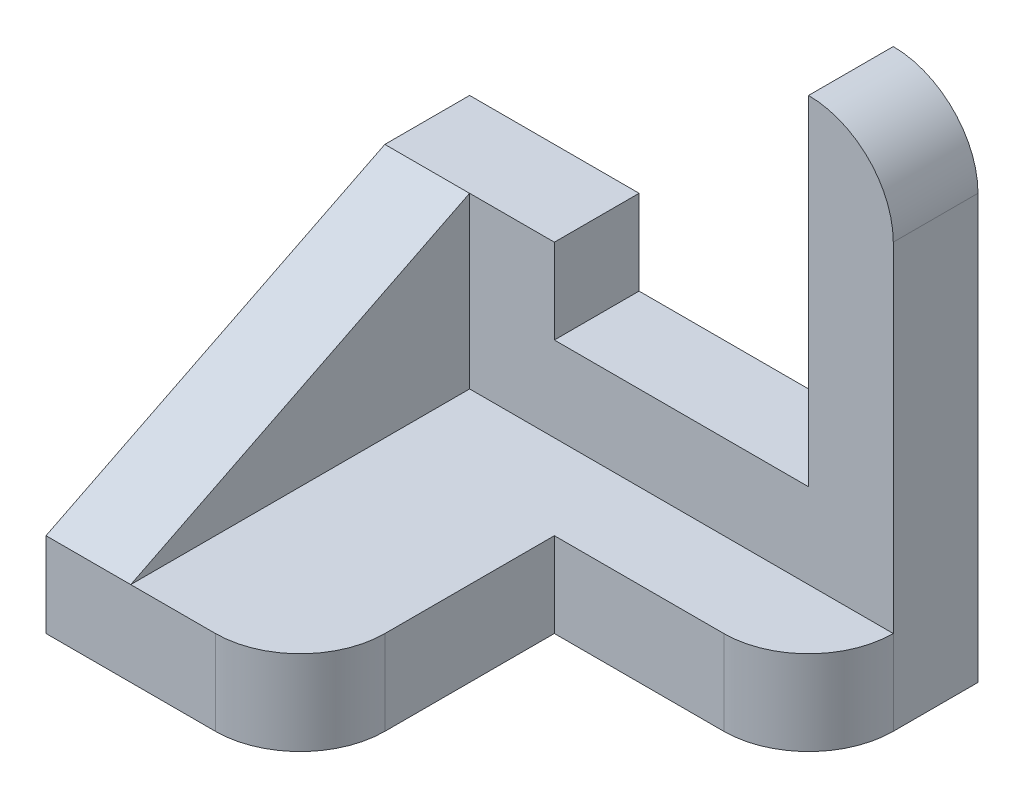
ISO-10303-21;
HEADER;
FILE_DESCRIPTION(('STEP AP214'),'2;1');
FILE_NAME('part.step','',(''),(''),'','','');
FILE_SCHEMA(('AUTOMOTIVE_DESIGN { 1 0 10303 214 1 1 1 1 }'));
ENDSEC;
DATA;
#1=APPLICATION_CONTEXT('core data for automotive mechanical design processes');
#2=APPLICATION_PROTOCOL_DEFINITION('international standard','automotive_design',2000,#1);
#3=PRODUCT_CONTEXT('',#1,'mechanical');
#4=PRODUCT('Part','Part','',(#3));
#5=PRODUCT_RELATED_PRODUCT_CATEGORY('part','',(#4));
#6=PRODUCT_DEFINITION_FORMATION('','',#4);
#7=PRODUCT_DEFINITION_CONTEXT('part definition',#1,'design');
#8=PRODUCT_DEFINITION('design','',#6,#7);
#9=PRODUCT_DEFINITION_SHAPE('','',#8);
#10=(LENGTH_UNIT() NAMED_UNIT(*) SI_UNIT(.MILLI.,.METRE.));
#11=(NAMED_UNIT(*) PLANE_ANGLE_UNIT() SI_UNIT($,.RADIAN.));
#12=(NAMED_UNIT(*) SI_UNIT($,.STERADIAN.) SOLID_ANGLE_UNIT());
#13=UNCERTAINTY_MEASURE_WITH_UNIT(LENGTH_MEASURE(1.E-05),#10,'distance_accuracy_value','');
#14=(GEOMETRIC_REPRESENTATION_CONTEXT(3) GLOBAL_UNCERTAINTY_ASSIGNED_CONTEXT((#13)) GLOBAL_UNIT_ASSIGNED_CONTEXT((#10,
#11,#12)) REPRESENTATION_CONTEXT('',''));
#15=CARTESIAN_POINT('',(0.,0.,0.));
#16=DIRECTION('',(0.,0.,1.));
#17=DIRECTION('',(1.,0.,0.));
#18=AXIS2_PLACEMENT_3D('',#15,#16,#17);
#19=CARTESIAN_POINT('',(-52.8523690129948,20.,0.));
#20=DIRECTION('',(-1.,0.,0.));
#21=DIRECTION('',(0.,0.,1.));
#22=AXIS2_PLACEMENT_3D('',#19,#20,#21);
#23=PLANE('',#22);
#24=DIRECTION('',(0.,-1.,0.));
#25=VECTOR('',#24,1.);
#26=CARTESIAN_POINT('',(-52.8523690129948,20.,-20.));
#27=LINE('',#26,#25);
#28=CARTESIAN_POINT('',(-52.8523690129948,20.,-20.));
#29=VERTEX_POINT('',#28);
#30=CARTESIAN_POINT('',(-52.8523690129948,-10.,-20.));
#31=VERTEX_POINT('',#30);
#32=EDGE_CURVE('E218',#29,#31,#27,.T.);
#33=ORIENTED_EDGE('',*,*,#32,.T.);
#34=DIRECTION('',(0.,0.,-1.));
#35=VECTOR('',#34,1.);
#36=CARTESIAN_POINT('',(-52.8523690129948,-10.,0.));
#37=LINE('',#36,#35);
#38=CARTESIAN_POINT('',(-52.8523690129948,-10.,30.));
#39=VERTEX_POINT('',#38);
#40=EDGE_CURVE('E158',#39,#31,#37,.T.);
#41=ORIENTED_EDGE('',*,*,#40,.F.);
#42=DIRECTION('',(0.,1.,0.));
#43=VECTOR('',#42,1.);
#44=CARTESIAN_POINT('',(-52.8523690129948,-10.,30.));
#45=LINE('',#44,#43);
#46=CARTESIAN_POINT('',(-52.8523690129948,0.,30.));
#47=VERTEX_POINT('',#46);
#48=EDGE_CURVE('E180',#39,#47,#45,.T.);
#49=ORIENTED_EDGE('',*,*,#48,.T.);
#50=DIRECTION('',(0.,0.447290848418711,-0.894388560370083));
#51=VECTOR('',#50,1.);
#52=CARTESIAN_POINT('',(-52.8523690129948,16.0029366011003,-1.99896326730458));
#53=LINE('',#52,#51);
#54=CARTESIAN_POINT('',(-52.8523690129948,20.,-9.99136416637985));
#55=VERTEX_POINT('',#54);
#56=EDGE_CURVE('E219',#47,#55,#53,.T.);
#57=ORIENTED_EDGE('',*,*,#56,.T.);
#58=DIRECTION('',(0.,0.,-1.));
#59=VECTOR('',#58,1.);
#60=CARTESIAN_POINT('',(-52.8523690129948,20.,0.));
#61=LINE('',#60,#59);
#62=EDGE_CURVE('E311',#55,#29,#61,.T.);
#63=ORIENTED_EDGE('',*,*,#62,.T.);
#64=EDGE_LOOP('',(#33,#41,#49,#57,#63));
#65=FACE_BOUND('',#64,.T.);
#66=ADVANCED_FACE('F35',(#65),#23,.T.);
#67=CARTESIAN_POINT('',(0.,20.,-10.));
#68=DIRECTION('',(0.,0.,-1.));
#69=DIRECTION('',(-1.,0.,0.));
#70=AXIS2_PLACEMENT_3D('',#67,#68,#69);
#71=PLANE('',#70);
#72=DIRECTION('',(0.,-1.,0.));
#73=VECTOR('',#72,1.);
#74=CARTESIAN_POINT('',(7.14763098700516,50.,-10.));
#75=LINE('',#74,#73);
#76=CARTESIAN_POINT('',(7.14763098700516,40.,-10.));
#77=VERTEX_POINT('',#76);
#78=CARTESIAN_POINT('',(7.14763098700516,0.,-10.));
#79=VERTEX_POINT('',#78);
#80=EDGE_CURVE('E147',#77,#79,#75,.T.);
#81=ORIENTED_EDGE('',*,*,#80,.F.);
#82=CARTESIAN_POINT('',(-2.85236901299484,40.,-10.));
#83=DIRECTION('',(0.,0.,-1.));
#84=DIRECTION('',(-1.,0.,0.));
#85=AXIS2_PLACEMENT_3D('',#82,#83,#84);
#86=CIRCLE('',#85,10.);
#87=CARTESIAN_POINT('',(-2.85236901299485,50.,-10.));
#88=VERTEX_POINT('',#87);
#89=EDGE_CURVE('E44',#77,#88,#86,.F.);
#90=ORIENTED_EDGE('',*,*,#89,.T.);
#91=DIRECTION('',(0.,-1.,0.));
#92=VECTOR('',#91,1.);
#93=CARTESIAN_POINT('',(-2.85236901299485,50.,-10.));
#94=LINE('',#93,#92);
#95=CARTESIAN_POINT('',(-2.85236901299485,10.,-10.));
#96=VERTEX_POINT('',#95);
#97=EDGE_CURVE('E192',#88,#96,#94,.T.);
#98=ORIENTED_EDGE('',*,*,#97,.T.);
#99=DIRECTION('',(1.,0.,0.));
#100=VECTOR('',#99,1.);
#101=CARTESIAN_POINT('',(0.,10.,-10.));
#102=LINE('',#101,#100);
#103=CARTESIAN_POINT('',(-32.8523690129948,10.,-10.));
#104=VERTEX_POINT('',#103);
#105=EDGE_CURVE('E227',#104,#96,#102,.T.);
#106=ORIENTED_EDGE('',*,*,#105,.F.);
#107=DIRECTION('',(0.,-1.,0.));
#108=VECTOR('',#107,1.);
#109=CARTESIAN_POINT('',(-32.8523690129948,20.,-10.));
#110=LINE('',#109,#108);
#111=CARTESIAN_POINT('',(-32.8523690129948,20.,-10.));
#112=VERTEX_POINT('',#111);
#113=EDGE_CURVE('E335',#112,#104,#110,.T.);
#114=ORIENTED_EDGE('',*,*,#113,.F.);
#115=DIRECTION('',(1.,0.,0.));
#116=VECTOR('',#115,1.);
#117=CARTESIAN_POINT('',(0.,20.,-10.));
#118=LINE('',#117,#116);
#119=CARTESIAN_POINT('',(-42.8523690129948,20.,-10.));
#120=VERTEX_POINT('',#119);
#121=EDGE_CURVE('E315',#120,#112,#118,.T.);
#122=ORIENTED_EDGE('',*,*,#121,.F.);
#123=DIRECTION('',(0.,-1.,0.));
#124=VECTOR('',#123,1.);
#125=CARTESIAN_POINT('',(-42.8523690129948,20.,-10.));
#126=LINE('',#125,#124);
#127=CARTESIAN_POINT('',(-42.8523690129948,0.,-10.));
#128=VERTEX_POINT('',#127);
#129=EDGE_CURVE('E354',#120,#128,#126,.T.);
#130=ORIENTED_EDGE('',*,*,#129,.T.);
#131=DIRECTION('',(1.,0.,0.));
#132=VECTOR('',#131,1.);
#133=CARTESIAN_POINT('',(0.,0.,-10.));
#134=LINE('',#133,#132);
#135=EDGE_CURVE('E247',#128,#79,#134,.T.);
#136=ORIENTED_EDGE('',*,*,#135,.T.);
#137=EDGE_LOOP('',(#81,#90,#98,#106,#114,#122,#130,#136));
#138=FACE_BOUND('',#137,.T.);
#139=ADVANCED_FACE('F292',(#138),#71,.F.);
#140=CARTESIAN_POINT('',(0.,20.,-20.));
#141=DIRECTION('',(0.,0.,-1.));
#142=DIRECTION('',(-1.,0.,0.));
#143=AXIS2_PLACEMENT_3D('',#140,#141,#142);
#144=PLANE('',#143);
#145=DIRECTION('',(0.,-1.,0.));
#146=VECTOR('',#145,1.);
#147=CARTESIAN_POINT('',(-2.85236901299485,50.,-20.));
#148=LINE('',#147,#146);
#149=CARTESIAN_POINT('',(-2.85236901299485,50.,-20.));
#150=VERTEX_POINT('',#149);
#151=CARTESIAN_POINT('',(-2.85236901299485,10.,-20.));
#152=VERTEX_POINT('',#151);
#153=EDGE_CURVE('E199',#150,#152,#148,.T.);
#154=ORIENTED_EDGE('',*,*,#153,.F.);
#155=CARTESIAN_POINT('',(-2.85236901299485,40.,-20.));
#156=DIRECTION('',(0.,0.,-1.));
#157=DIRECTION('',(-1.,0.,0.));
#158=AXIS2_PLACEMENT_3D('',#155,#156,#157);
#159=CIRCLE('',#158,10.);
#160=CARTESIAN_POINT('',(7.14763098700515,40.,-20.));
#161=VERTEX_POINT('',#160);
#162=EDGE_CURVE('E11',#150,#161,#159,.T.);
#163=ORIENTED_EDGE('',*,*,#162,.T.);
#164=DIRECTION('',(0.,-1.,0.));
#165=VECTOR('',#164,1.);
#166=CARTESIAN_POINT('',(7.14763098700515,50.,-20.));
#167=LINE('',#166,#165);
#168=CARTESIAN_POINT('',(7.14763098700515,-10.,-20.));
#169=VERTEX_POINT('',#168);
#170=EDGE_CURVE('E140',#161,#169,#167,.T.);
#171=ORIENTED_EDGE('',*,*,#170,.T.);
#172=DIRECTION('',(1.,0.,0.));
#173=VECTOR('',#172,1.);
#174=CARTESIAN_POINT('',(0.,-10.,-20.));
#175=LINE('',#174,#173);
#176=EDGE_CURVE('E144',#31,#169,#175,.T.);
#177=ORIENTED_EDGE('',*,*,#176,.F.);
#178=ORIENTED_EDGE('',*,*,#32,.F.);
#179=DIRECTION('',(1.,0.,0.));
#180=VECTOR('',#179,1.);
#181=CARTESIAN_POINT('',(0.,20.,-20.));
#182=LINE('',#181,#180);
#183=CARTESIAN_POINT('',(-32.8523690129948,20.,-20.));
#184=VERTEX_POINT('',#183);
#185=EDGE_CURVE('E313',#29,#184,#182,.T.);
#186=ORIENTED_EDGE('',*,*,#185,.T.);
#187=DIRECTION('',(0.,-1.,0.));
#188=VECTOR('',#187,1.);
#189=CARTESIAN_POINT('',(-32.8523690129948,20.,-20.));
#190=LINE('',#189,#188);
#191=CARTESIAN_POINT('',(-32.8523690129948,10.,-20.));
#192=VERTEX_POINT('',#191);
#193=EDGE_CURVE('E321',#184,#192,#190,.T.);
#194=ORIENTED_EDGE('',*,*,#193,.T.);
#195=DIRECTION('',(1.,0.,0.));
#196=VECTOR('',#195,1.);
#197=CARTESIAN_POINT('',(0.,10.,-20.));
#198=LINE('',#197,#196);
#199=EDGE_CURVE('E211',#192,#152,#198,.T.);
#200=ORIENTED_EDGE('',*,*,#199,.T.);
#201=EDGE_LOOP('',(#154,#163,#171,#177,#178,#186,#194,#200));
#202=FACE_BOUND('',#201,.T.);
#203=ADVANCED_FACE('F142',(#202),#144,.T.);
#204=CARTESIAN_POINT('',(0.,20.,0.));
#205=DIRECTION('',(0.,1.,0.));
#206=DIRECTION('',(0.,0.,1.));
#207=AXIS2_PLACEMENT_3D('',#204,#205,#206);
#208=PLANE('',#207);
#209=ORIENTED_EDGE('',*,*,#62,.F.);
#210=DIRECTION('',(1.,0.,0.));
#211=VECTOR('',#210,1.);
#212=CARTESIAN_POINT('',(-42.8523690129948,20.,-9.99136416637985));
#213=LINE('',#212,#211);
#214=CARTESIAN_POINT('',(-42.8523690129948,20.,-9.99136416637985));
#215=VERTEX_POINT('',#214);
#216=EDGE_CURVE('E214',#55,#215,#213,.T.);
#217=ORIENTED_EDGE('',*,*,#216,.T.);
#218=DIRECTION('',(0.,0.,1.));
#219=VECTOR('',#218,1.);
#220=CARTESIAN_POINT('',(-42.8523690129948,20.,0.));
#221=LINE('',#220,#219);
#222=EDGE_CURVE('E236',#120,#215,#221,.T.);
#223=ORIENTED_EDGE('',*,*,#222,.F.);
#224=ORIENTED_EDGE('',*,*,#121,.T.);
#225=DIRECTION('',(0.,0.,1.));
#226=VECTOR('',#225,1.);
#227=CARTESIAN_POINT('',(-32.8523690129948,20.,0.));
#228=LINE('',#227,#226);
#229=EDGE_CURVE('E339',#184,#112,#228,.T.);
#230=ORIENTED_EDGE('',*,*,#229,.F.);
#231=ORIENTED_EDGE('',*,*,#185,.F.);
#232=EDGE_LOOP('',(#209,#217,#223,#224,#230,#231));
#233=FACE_BOUND('',#232,.T.);
#234=ADVANCED_FACE('F364',(#233),#208,.T.);
#235=CARTESIAN_POINT('',(-32.8523690129948,20.,0.));
#236=DIRECTION('',(1.,0.,0.));
#237=DIRECTION('',(0.,0.,-1.));
#238=AXIS2_PLACEMENT_3D('',#235,#236,#237);
#239=PLANE('',#238);
#240=DIRECTION('',(0.,0.,1.));
#241=VECTOR('',#240,1.);
#242=CARTESIAN_POINT('',(-32.8523690129948,10.,0.));
#243=LINE('',#242,#241);
#244=EDGE_CURVE('E340',#192,#104,#243,.T.);
#245=ORIENTED_EDGE('',*,*,#244,.F.);
#246=ORIENTED_EDGE('',*,*,#193,.F.);
#247=ORIENTED_EDGE('',*,*,#229,.T.);
#248=ORIENTED_EDGE('',*,*,#113,.T.);
#249=EDGE_LOOP('',(#245,#246,#247,#248));
#250=FACE_BOUND('',#249,.T.);
#251=ADVANCED_FACE('F362',(#250),#239,.T.);
#252=CARTESIAN_POINT('',(-42.8523690129948,20.,0.));
#253=DIRECTION('',(1.,0.,0.));
#254=DIRECTION('',(0.,0.,-1.));
#255=AXIS2_PLACEMENT_3D('',#252,#253,#254);
#256=PLANE('',#255);
#257=ORIENTED_EDGE('',*,*,#222,.T.);
#258=DIRECTION('',(0.,-0.447290848418711,0.894388560370083));
#259=VECTOR('',#258,1.);
#260=CARTESIAN_POINT('',(-42.8523690129948,16.0029366011003,-1.99896326730458));
#261=LINE('',#260,#259);
#262=CARTESIAN_POINT('',(-42.8523690129948,0.,30.));
#263=VERTEX_POINT('',#262);
#264=EDGE_CURVE('E217',#215,#263,#261,.T.);
#265=ORIENTED_EDGE('',*,*,#264,.T.);
#266=DIRECTION('',(0.,0.,1.));
#267=VECTOR('',#266,1.);
#268=CARTESIAN_POINT('',(-42.8523690129948,0.,0.));
#269=LINE('',#268,#267);
#270=EDGE_CURVE('E226',#128,#263,#269,.T.);
#271=ORIENTED_EDGE('',*,*,#270,.F.);
#272=ORIENTED_EDGE('',*,*,#129,.F.);
#273=EDGE_LOOP('',(#257,#265,#271,#272));
#274=FACE_BOUND('',#273,.T.);
#275=ADVANCED_FACE('F233',(#274),#256,.T.);
#276=CARTESIAN_POINT('',(0.,10.,0.));
#277=DIRECTION('',(0.,1.,0.));
#278=DIRECTION('',(0.,0.,1.));
#279=AXIS2_PLACEMENT_3D('',#276,#277,#278);
#280=PLANE('',#279);
#281=DIRECTION('',(0.,0.,1.));
#282=VECTOR('',#281,1.);
#283=CARTESIAN_POINT('',(-2.85236901299484,10.,0.));
#284=LINE('',#283,#282);
#285=EDGE_CURVE('E202',#152,#96,#284,.T.);
#286=ORIENTED_EDGE('',*,*,#285,.F.);
#287=ORIENTED_EDGE('',*,*,#199,.F.);
#288=ORIENTED_EDGE('',*,*,#244,.T.);
#289=ORIENTED_EDGE('',*,*,#105,.T.);
#290=EDGE_LOOP('',(#286,#287,#288,#289));
#291=FACE_BOUND('',#290,.T.);
#292=ADVANCED_FACE('F366',(#291),#280,.T.);
#293=CARTESIAN_POINT('',(-2.85236901299484,50.,0.));
#294=DIRECTION('',(1.,0.,0.));
#295=DIRECTION('',(0.,0.,-1.));
#296=AXIS2_PLACEMENT_3D('',#293,#294,#295);
#297=PLANE('',#296);
#298=ORIENTED_EDGE('',*,*,#153,.T.);
#299=ORIENTED_EDGE('',*,*,#285,.T.);
#300=ORIENTED_EDGE('',*,*,#97,.F.);
#301=DIRECTION('',(0.,0.,1.));
#302=VECTOR('',#301,1.);
#303=CARTESIAN_POINT('',(-2.85236901299484,50.,0.));
#304=LINE('',#303,#302);
#305=EDGE_CURVE('E148',#150,#88,#304,.T.);
#306=ORIENTED_EDGE('',*,*,#305,.F.);
#307=EDGE_LOOP('',(#298,#299,#300,#306));
#308=FACE_BOUND('',#307,.T.);
#309=ADVANCED_FACE('F307',(#308),#297,.F.);
#310=CARTESIAN_POINT('',(7.14763098700516,50.,0.));
#311=DIRECTION('',(1.,0.,0.));
#312=DIRECTION('',(0.,0.,-1.));
#313=AXIS2_PLACEMENT_3D('',#310,#311,#312);
#314=PLANE('',#313);
#315=ORIENTED_EDGE('',*,*,#170,.F.);
#316=DIRECTION('',(0.,0.,1.));
#317=VECTOR('',#316,1.);
#318=CARTESIAN_POINT('',(7.14763098700516,40.,0.));
#319=LINE('',#318,#317);
#320=EDGE_CURVE('E221',#161,#77,#319,.T.);
#321=ORIENTED_EDGE('',*,*,#320,.T.);
#322=ORIENTED_EDGE('',*,*,#80,.T.);
#323=DIRECTION('',(0.,1.,0.));
#324=VECTOR('',#323,1.);
#325=CARTESIAN_POINT('',(7.14763098700516,-10.,-10.));
#326=LINE('',#325,#324);
#327=CARTESIAN_POINT('',(7.14763098700516,-10.,-10.));
#328=VERTEX_POINT('',#327);
#329=EDGE_CURVE('E162',#328,#79,#326,.T.);
#330=ORIENTED_EDGE('',*,*,#329,.F.);
#331=DIRECTION('',(0.,0.,1.));
#332=VECTOR('',#331,1.);
#333=CARTESIAN_POINT('',(7.14763098700516,-10.,0.));
#334=LINE('',#333,#332);
#335=EDGE_CURVE('E154',#169,#328,#334,.T.);
#336=ORIENTED_EDGE('',*,*,#335,.F.);
#337=EDGE_LOOP('',(#315,#321,#322,#330,#336));
#338=FACE_BOUND('',#337,.T.);
#339=ADVANCED_FACE('F160',(#338),#314,.T.);
#340=CARTESIAN_POINT('',(0.,20.,-9.99136416637984));
#341=DIRECTION('',(0.,0.894388560370083,0.447290848418711));
#342=DIRECTION('',(-1.,0.,0.));
#343=AXIS2_PLACEMENT_3D('',#340,#341,#342);
#344=PLANE('',#343);
#345=ORIENTED_EDGE('',*,*,#56,.F.);
#346=DIRECTION('',(1.,0.,0.));
#347=VECTOR('',#346,1.);
#348=CARTESIAN_POINT('',(0.,0.,30.));
#349=LINE('',#348,#347);
#350=EDGE_CURVE('E224',#47,#263,#349,.T.);
#351=ORIENTED_EDGE('',*,*,#350,.T.);
#352=ORIENTED_EDGE('',*,*,#264,.F.);
#353=ORIENTED_EDGE('',*,*,#216,.F.);
#354=EDGE_LOOP('',(#345,#351,#352,#353));
#355=FACE_BOUND('',#354,.T.);
#356=ADVANCED_FACE('F301',(#355),#344,.T.);
#357=CARTESIAN_POINT('',(-2.85236901299484,40.,0.));
#358=DIRECTION('',(0.,0.,1.));
#359=DIRECTION('',(1.,0.,0.));
#360=AXIS2_PLACEMENT_3D('',#357,#358,#359);
#361=CYLINDRICAL_SURFACE('',#360,10.);
#362=ORIENTED_EDGE('',*,*,#162,.F.);
#363=ORIENTED_EDGE('',*,*,#305,.T.);
#364=ORIENTED_EDGE('',*,*,#89,.F.);
#365=ORIENTED_EDGE('',*,*,#320,.F.);
#366=EDGE_LOOP('',(#362,#363,#364,#365));
#367=FACE_BOUND('',#366,.T.);
#368=ADVANCED_FACE('F37',(#367),#361,.T.);
#369=CARTESIAN_POINT('',(0.,0.,0.));
#370=DIRECTION('',(0.,1.,0.));
#371=DIRECTION('',(0.,0.,1.));
#372=AXIS2_PLACEMENT_3D('',#369,#370,#371);
#373=PLANE('',#372);
#374=ORIENTED_EDGE('',*,*,#135,.F.);
#375=ORIENTED_EDGE('',*,*,#270,.T.);
#376=DIRECTION('',(1.,0.,0.));
#377=VECTOR('',#376,1.);
#378=CARTESIAN_POINT('',(0.,0.,30.));
#379=LINE('',#378,#377);
#380=CARTESIAN_POINT('',(-32.8523690129948,0.,30.));
#381=VERTEX_POINT('',#380);
#382=EDGE_CURVE('E186',#263,#381,#379,.T.);
#383=ORIENTED_EDGE('',*,*,#382,.T.);
#384=CARTESIAN_POINT('',(-32.8523690129948,0.,20.));
#385=DIRECTION('',(0.,1.,0.));
#386=DIRECTION('',(0.,0.,1.));
#387=AXIS2_PLACEMENT_3D('',#384,#385,#386);
#388=CIRCLE('',#387,10.);
#389=CARTESIAN_POINT('',(-22.8523690129948,0.,20.));
#390=VERTEX_POINT('',#389);
#391=EDGE_CURVE('E183',#390,#381,#388,.F.);
#392=ORIENTED_EDGE('',*,*,#391,.F.);
#393=DIRECTION('',(0.,0.,1.));
#394=VECTOR('',#393,1.);
#395=CARTESIAN_POINT('',(-22.8523690129948,0.,0.));
#396=LINE('',#395,#394);
#397=CARTESIAN_POINT('',(-22.8523690129948,0.,0.));
#398=VERTEX_POINT('',#397);
#399=EDGE_CURVE('E262',#398,#390,#396,.T.);
#400=ORIENTED_EDGE('',*,*,#399,.F.);
#401=DIRECTION('',(-1.,0.,0.));
#402=VECTOR('',#401,1.);
#403=CARTESIAN_POINT('',(0.,0.,0.));
#404=LINE('',#403,#402);
#405=CARTESIAN_POINT('',(-2.85236901299484,0.,0.));
#406=VERTEX_POINT('',#405);
#407=EDGE_CURVE('E165',#406,#398,#404,.T.);
#408=ORIENTED_EDGE('',*,*,#407,.F.);
#409=CARTESIAN_POINT('',(-2.85236901299484,0.,-10.));
#410=DIRECTION('',(0.,1.,0.));
#411=DIRECTION('',(0.,0.,1.));
#412=AXIS2_PLACEMENT_3D('',#409,#410,#411);
#413=CIRCLE('',#412,10.);
#414=EDGE_CURVE('E163',#79,#406,#413,.F.);
#415=ORIENTED_EDGE('',*,*,#414,.F.);
#416=EDGE_LOOP('',(#374,#375,#383,#392,#400,#408,#415));
#417=FACE_BOUND('',#416,.T.);
#418=ADVANCED_FACE('F242',(#417),#373,.T.);
#419=CARTESIAN_POINT('',(-2.85236901299484,-10.,-10.));
#420=DIRECTION('',(0.,1.,0.));
#421=DIRECTION('',(0.,0.,1.));
#422=AXIS2_PLACEMENT_3D('',#419,#420,#421);
#423=CYLINDRICAL_SURFACE('',#422,10.);
#424=ORIENTED_EDGE('',*,*,#414,.T.);
#425=DIRECTION('',(0.,1.,0.));
#426=VECTOR('',#425,1.);
#427=CARTESIAN_POINT('',(-2.85236901299484,-10.,0.));
#428=LINE('',#427,#426);
#429=CARTESIAN_POINT('',(-2.85236901299484,-10.,0.));
#430=VERTEX_POINT('',#429);
#431=EDGE_CURVE('E268',#430,#406,#428,.T.);
#432=ORIENTED_EDGE('',*,*,#431,.F.);
#433=CARTESIAN_POINT('',(-2.85236901299484,-10.,-10.));
#434=DIRECTION('',(0.,1.,0.));
#435=DIRECTION('',(0.,0.,1.));
#436=AXIS2_PLACEMENT_3D('',#433,#434,#435);
#437=CIRCLE('',#436,10.);
#438=EDGE_CURVE('E178',#328,#430,#437,.F.);
#439=ORIENTED_EDGE('',*,*,#438,.F.);
#440=ORIENTED_EDGE('',*,*,#329,.T.);
#441=EDGE_LOOP('',(#424,#432,#439,#440));
#442=FACE_BOUND('',#441,.T.);
#443=ADVANCED_FACE('F282',(#442),#423,.T.);
#444=CARTESIAN_POINT('',(0.,-10.,0.));
#445=DIRECTION('',(0.,0.,-1.));
#446=DIRECTION('',(-1.,0.,0.));
#447=AXIS2_PLACEMENT_3D('',#444,#445,#446);
#448=PLANE('',#447);
#449=ORIENTED_EDGE('',*,*,#407,.T.);
#450=DIRECTION('',(0.,1.,0.));
#451=VECTOR('',#450,1.);
#452=CARTESIAN_POINT('',(-22.8523690129948,-10.,0.));
#453=LINE('',#452,#451);
#454=CARTESIAN_POINT('',(-22.8523690129948,-10.,0.));
#455=VERTEX_POINT('',#454);
#456=EDGE_CURVE('E271',#455,#398,#453,.T.);
#457=ORIENTED_EDGE('',*,*,#456,.F.);
#458=DIRECTION('',(-1.,0.,0.));
#459=VECTOR('',#458,1.);
#460=CARTESIAN_POINT('',(0.,-10.,0.));
#461=LINE('',#460,#459);
#462=EDGE_CURVE('E176',#430,#455,#461,.T.);
#463=ORIENTED_EDGE('',*,*,#462,.F.);
#464=ORIENTED_EDGE('',*,*,#431,.T.);
#465=EDGE_LOOP('',(#449,#457,#463,#464));
#466=FACE_BOUND('',#465,.T.);
#467=ADVANCED_FACE('F279',(#466),#448,.F.);
#468=CARTESIAN_POINT('',(-22.8523690129948,-10.,0.));
#469=DIRECTION('',(-1.,0.,0.));
#470=DIRECTION('',(0.,0.,1.));
#471=AXIS2_PLACEMENT_3D('',#468,#469,#470);
#472=PLANE('',#471);
#473=ORIENTED_EDGE('',*,*,#399,.T.);
#474=DIRECTION('',(0.,1.,0.));
#475=VECTOR('',#474,1.);
#476=CARTESIAN_POINT('',(-22.8523690129948,-10.,20.));
#477=LINE('',#476,#475);
#478=CARTESIAN_POINT('',(-22.8523690129948,-10.,20.));
#479=VERTEX_POINT('',#478);
#480=EDGE_CURVE('E257',#479,#390,#477,.T.);
#481=ORIENTED_EDGE('',*,*,#480,.F.);
#482=DIRECTION('',(0.,0.,1.));
#483=VECTOR('',#482,1.);
#484=CARTESIAN_POINT('',(-22.8523690129948,-10.,0.));
#485=LINE('',#484,#483);
#486=EDGE_CURVE('E174',#455,#479,#485,.T.);
#487=ORIENTED_EDGE('',*,*,#486,.F.);
#488=ORIENTED_EDGE('',*,*,#456,.T.);
#489=EDGE_LOOP('',(#473,#481,#487,#488));
#490=FACE_BOUND('',#489,.T.);
#491=ADVANCED_FACE('F275',(#490),#472,.F.);
#492=CARTESIAN_POINT('',(-32.8523690129948,-10.,20.));
#493=DIRECTION('',(0.,1.,0.));
#494=DIRECTION('',(0.,0.,1.));
#495=AXIS2_PLACEMENT_3D('',#492,#493,#494);
#496=CYLINDRICAL_SURFACE('',#495,10.);
#497=ORIENTED_EDGE('',*,*,#391,.T.);
#498=DIRECTION('',(0.,1.,0.));
#499=VECTOR('',#498,1.);
#500=CARTESIAN_POINT('',(-32.8523690129948,-10.,30.));
#501=LINE('',#500,#499);
#502=CARTESIAN_POINT('',(-32.8523690129948,-10.,30.));
#503=VERTEX_POINT('',#502);
#504=EDGE_CURVE('E253',#503,#381,#501,.T.);
#505=ORIENTED_EDGE('',*,*,#504,.F.);
#506=CARTESIAN_POINT('',(-32.8523690129948,-10.,20.));
#507=DIRECTION('',(0.,1.,0.));
#508=DIRECTION('',(0.,0.,1.));
#509=AXIS2_PLACEMENT_3D('',#506,#507,#508);
#510=CIRCLE('',#509,10.);
#511=EDGE_CURVE('E172',#479,#503,#510,.F.);
#512=ORIENTED_EDGE('',*,*,#511,.F.);
#513=ORIENTED_EDGE('',*,*,#480,.T.);
#514=EDGE_LOOP('',(#497,#505,#512,#513));
#515=FACE_BOUND('',#514,.T.);
#516=ADVANCED_FACE('F259',(#515),#496,.T.);
#517=CARTESIAN_POINT('',(0.,-10.,30.));
#518=DIRECTION('',(0.,0.,1.));
#519=DIRECTION('',(1.,0.,0.));
#520=AXIS2_PLACEMENT_3D('',#517,#518,#519);
#521=PLANE('',#520);
#522=ORIENTED_EDGE('',*,*,#350,.F.);
#523=ORIENTED_EDGE('',*,*,#48,.F.);
#524=DIRECTION('',(1.,0.,0.));
#525=VECTOR('',#524,1.);
#526=CARTESIAN_POINT('',(0.,-10.,30.));
#527=LINE('',#526,#525);
#528=EDGE_CURVE('E169',#39,#503,#527,.T.);
#529=ORIENTED_EDGE('',*,*,#528,.T.);
#530=ORIENTED_EDGE('',*,*,#504,.T.);
#531=ORIENTED_EDGE('',*,*,#382,.F.);
#532=EDGE_LOOP('',(#522,#523,#529,#530,#531));
#533=FACE_BOUND('',#532,.T.);
#534=ADVANCED_FACE('F251',(#533),#521,.T.);
#535=CARTESIAN_POINT('',(0.,-10.,0.));
#536=DIRECTION('',(0.,1.,0.));
#537=DIRECTION('',(0.,0.,1.));
#538=AXIS2_PLACEMENT_3D('',#535,#536,#537);
#539=PLANE('',#538);
#540=ORIENTED_EDGE('',*,*,#335,.T.);
#541=ORIENTED_EDGE('',*,*,#438,.T.);
#542=ORIENTED_EDGE('',*,*,#462,.T.);
#543=ORIENTED_EDGE('',*,*,#486,.T.);
#544=ORIENTED_EDGE('',*,*,#511,.T.);
#545=ORIENTED_EDGE('',*,*,#528,.F.);
#546=ORIENTED_EDGE('',*,*,#40,.T.);
#547=ORIENTED_EDGE('',*,*,#176,.T.);
#548=EDGE_LOOP('',(#540,#541,#542,#543,#544,#545,#546,#547));
#549=FACE_BOUND('',#548,.T.);
#550=ADVANCED_FACE('F153',(#549),#539,.F.);
#551=CLOSED_SHELL('',(#66,#139,#203,#234,#251,#275,#292,#309,#339,#356,#368,#418,#443,#467,#491,
#516,#534,#550));
#552=MANIFOLD_SOLID_BREP('B2',#551);
#553=ADVANCED_BREP_SHAPE_REPRESENTATION('',(#18,#552),#14);
#554=SHAPE_DEFINITION_REPRESENTATION(#9,#553);
ENDSEC;
END-ISO-10303-21;
